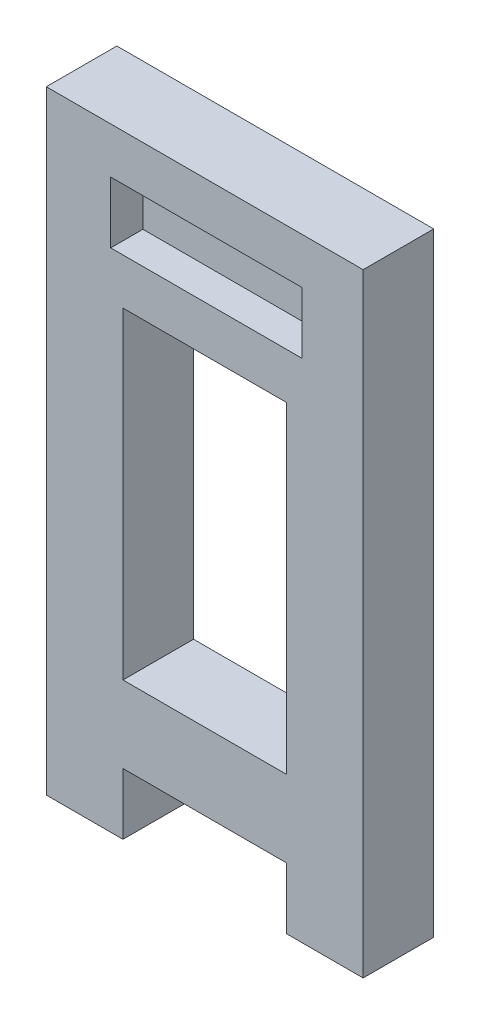
ISO-10303-21;
HEADER;
FILE_DESCRIPTION(('STEP AP214'),'2;1');
FILE_NAME('part.step','',(''),(''),'','','');
FILE_SCHEMA(('AUTOMOTIVE_DESIGN { 1 0 10303 214 1 1 1 1 }'));
ENDSEC;
DATA;
#1=APPLICATION_CONTEXT('core data for automotive mechanical design processes');
#2=APPLICATION_PROTOCOL_DEFINITION('international standard','automotive_design',2000,#1);
#3=PRODUCT_CONTEXT('',#1,'mechanical');
#4=PRODUCT('Part','Part','',(#3));
#5=PRODUCT_RELATED_PRODUCT_CATEGORY('part','',(#4));
#6=PRODUCT_DEFINITION_FORMATION('','',#4);
#7=PRODUCT_DEFINITION_CONTEXT('part definition',#1,'design');
#8=PRODUCT_DEFINITION('design','',#6,#7);
#9=PRODUCT_DEFINITION_SHAPE('','',#8);
#10=(LENGTH_UNIT() NAMED_UNIT(*) SI_UNIT(.MILLI.,.METRE.));
#11=(NAMED_UNIT(*) PLANE_ANGLE_UNIT() SI_UNIT($,.RADIAN.));
#12=(NAMED_UNIT(*) SI_UNIT($,.STERADIAN.) SOLID_ANGLE_UNIT());
#13=UNCERTAINTY_MEASURE_WITH_UNIT(LENGTH_MEASURE(1.E-05),#10,'distance_accuracy_value','');
#14=(GEOMETRIC_REPRESENTATION_CONTEXT(3) GLOBAL_UNCERTAINTY_ASSIGNED_CONTEXT((#13)) GLOBAL_UNIT_ASSIGNED_CONTEXT((#10,
#11,#12)) REPRESENTATION_CONTEXT('',''));
#15=CARTESIAN_POINT('',(0.,0.,0.));
#16=DIRECTION('',(0.,0.,1.));
#17=DIRECTION('',(1.,0.,0.));
#18=AXIS2_PLACEMENT_3D('',#15,#16,#17);
#19=CARTESIAN_POINT('',(2.1,14.5,2.3));
#20=DIRECTION('',(1.,0.,0.));
#21=DIRECTION('',(0.,0.,-1.));
#22=AXIS2_PLACEMENT_3D('',#19,#20,#21);
#23=PLANE('',#22);
#24=DIRECTION('',(0.,0.,-1.));
#25=VECTOR('',#24,1.);
#26=CARTESIAN_POINT('',(2.1,14.5,2.3));
#27=LINE('',#26,#25);
#28=CARTESIAN_POINT('',(2.1,14.5,2.3));
#29=VERTEX_POINT('',#28);
#30=CARTESIAN_POINT('',(2.1,14.5,1.25));
#31=VERTEX_POINT('',#30);
#32=EDGE_CURVE('E162',#29,#31,#27,.T.);
#33=ORIENTED_EDGE('',*,*,#32,.T.);
#34=DIRECTION('',(0.,1.,0.));
#35=VECTOR('',#34,1.);
#36=CARTESIAN_POINT('',(2.1,14.5,1.25));
#37=LINE('',#36,#35);
#38=CARTESIAN_POINT('',(2.1,16.5,1.25));
#39=VERTEX_POINT('',#38);
#40=EDGE_CURVE('E152',#31,#39,#37,.T.);
#41=ORIENTED_EDGE('',*,*,#40,.T.);
#42=DIRECTION('',(0.,0.,-1.));
#43=VECTOR('',#42,1.);
#44=CARTESIAN_POINT('',(2.1,16.5,2.3));
#45=LINE('',#44,#43);
#46=CARTESIAN_POINT('',(2.1,16.5,2.3));
#47=VERTEX_POINT('',#46);
#48=EDGE_CURVE('E159',#47,#39,#45,.T.);
#49=ORIENTED_EDGE('',*,*,#48,.F.);
#50=DIRECTION('',(0.,-1.,0.));
#51=VECTOR('',#50,1.);
#52=CARTESIAN_POINT('',(2.1,14.5,2.3));
#53=LINE('',#52,#51);
#54=EDGE_CURVE('E479',#47,#29,#53,.T.);
#55=ORIENTED_EDGE('',*,*,#54,.T.);
#56=EDGE_LOOP('',(#33,#41,#49,#55));
#57=FACE_BOUND('',#56,.T.);
#58=ADVANCED_FACE('F39',(#57),#23,.T.);
#59=CARTESIAN_POINT('',(2.1,14.5,2.3));
#60=DIRECTION('',(0.,1.,0.));
#61=DIRECTION('',(0.,0.,1.));
#62=AXIS2_PLACEMENT_3D('',#59,#60,#61);
#63=PLANE('',#62);
#64=DIRECTION('',(0.,0.,-1.));
#65=VECTOR('',#64,1.);
#66=CARTESIAN_POINT('',(8.33,14.5,2.3));
#67=LINE('',#66,#65);
#68=CARTESIAN_POINT('',(8.33,14.5,2.3));
#69=VERTEX_POINT('',#68);
#70=CARTESIAN_POINT('',(8.33,14.5,1.25));
#71=VERTEX_POINT('',#70);
#72=EDGE_CURVE('E168',#69,#71,#67,.T.);
#73=ORIENTED_EDGE('',*,*,#72,.T.);
#74=DIRECTION('',(1.,0.,0.));
#75=VECTOR('',#74,1.);
#76=CARTESIAN_POINT('',(2.1,14.5,1.25));
#77=LINE('',#76,#75);
#78=EDGE_CURVE('E480',#31,#71,#77,.T.);
#79=ORIENTED_EDGE('',*,*,#78,.F.);
#80=ORIENTED_EDGE('',*,*,#32,.F.);
#81=DIRECTION('',(1.,0.,0.));
#82=VECTOR('',#81,1.);
#83=CARTESIAN_POINT('',(2.1,14.5,2.3));
#84=LINE('',#83,#82);
#85=EDGE_CURVE('E478',#29,#69,#84,.T.);
#86=ORIENTED_EDGE('',*,*,#85,.T.);
#87=EDGE_LOOP('',(#73,#79,#80,#86));
#88=FACE_BOUND('',#87,.T.);
#89=ADVANCED_FACE('F312',(#88),#63,.T.);
#90=CARTESIAN_POINT('',(8.33,14.5,2.3));
#91=DIRECTION('',(-1.,0.,0.));
#92=DIRECTION('',(0.,0.,1.));
#93=AXIS2_PLACEMENT_3D('',#90,#91,#92);
#94=PLANE('',#93);
#95=DIRECTION('',(0.,0.,-1.));
#96=VECTOR('',#95,1.);
#97=CARTESIAN_POINT('',(8.33,16.5,2.3));
#98=LINE('',#97,#96);
#99=CARTESIAN_POINT('',(8.33,16.5,2.3));
#100=VERTEX_POINT('',#99);
#101=CARTESIAN_POINT('',(8.33,16.5,1.25));
#102=VERTEX_POINT('',#101);
#103=EDGE_CURVE('E61',#100,#102,#98,.T.);
#104=ORIENTED_EDGE('',*,*,#103,.T.);
#105=DIRECTION('',(0.,1.,0.));
#106=VECTOR('',#105,1.);
#107=CARTESIAN_POINT('',(8.33,14.5,1.25));
#108=LINE('',#107,#106);
#109=EDGE_CURVE('E54',#71,#102,#108,.T.);
#110=ORIENTED_EDGE('',*,*,#109,.F.);
#111=ORIENTED_EDGE('',*,*,#72,.F.);
#112=DIRECTION('',(0.,1.,0.));
#113=VECTOR('',#112,1.);
#114=CARTESIAN_POINT('',(8.33,14.5,2.3));
#115=LINE('',#114,#113);
#116=EDGE_CURVE('E170',#69,#100,#115,.T.);
#117=ORIENTED_EDGE('',*,*,#116,.T.);
#118=EDGE_LOOP('',(#104,#110,#111,#117));
#119=FACE_BOUND('',#118,.T.);
#120=ADVANCED_FACE('F318',(#119),#94,.T.);
#121=CARTESIAN_POINT('',(2.1,16.5,2.3));
#122=DIRECTION('',(0.,-1.,0.));
#123=DIRECTION('',(0.,0.,-1.));
#124=AXIS2_PLACEMENT_3D('',#121,#122,#123);
#125=PLANE('',#124);
#126=ORIENTED_EDGE('',*,*,#48,.T.);
#127=DIRECTION('',(1.,0.,0.));
#128=VECTOR('',#127,1.);
#129=CARTESIAN_POINT('',(2.1,16.5,1.25));
#130=LINE('',#129,#128);
#131=EDGE_CURVE('E149',#39,#102,#130,.T.);
#132=ORIENTED_EDGE('',*,*,#131,.T.);
#133=ORIENTED_EDGE('',*,*,#103,.F.);
#134=DIRECTION('',(-1.,0.,0.));
#135=VECTOR('',#134,1.);
#136=CARTESIAN_POINT('',(2.1,16.5,2.3));
#137=LINE('',#136,#135);
#138=EDGE_CURVE('E166',#100,#47,#137,.T.);
#139=ORIENTED_EDGE('',*,*,#138,.T.);
#140=EDGE_LOOP('',(#126,#132,#133,#139));
#141=FACE_BOUND('',#140,.T.);
#142=ADVANCED_FACE('F164',(#141),#125,.T.);
#143=CARTESIAN_POINT('',(0.,0.,2.3));
#144=DIRECTION('',(0.,0.,-1.));
#145=DIRECTION('',(-1.,0.,0.));
#146=AXIS2_PLACEMENT_3D('',#143,#144,#145);
#147=PLANE('',#146);
#148=DIRECTION('',(0.,1.,0.));
#149=VECTOR('',#148,1.);
#150=CARTESIAN_POINT('',(7.83,2.5,2.3));
#151=LINE('',#150,#149);
#152=CARTESIAN_POINT('',(7.83,2.5,2.3));
#153=VERTEX_POINT('',#152);
#154=CARTESIAN_POINT('',(7.83,13.,2.3));
#155=VERTEX_POINT('',#154);
#156=EDGE_CURVE('E178',#153,#155,#151,.T.);
#157=ORIENTED_EDGE('',*,*,#156,.F.);
#158=DIRECTION('',(1.,0.,0.));
#159=VECTOR('',#158,1.);
#160=CARTESIAN_POINT('',(2.5,2.5,2.3));
#161=LINE('',#160,#159);
#162=CARTESIAN_POINT('',(2.5,2.5,2.3));
#163=VERTEX_POINT('',#162);
#164=EDGE_CURVE('E186',#163,#153,#161,.T.);
#165=ORIENTED_EDGE('',*,*,#164,.F.);
#166=DIRECTION('',(0.,-1.,0.));
#167=VECTOR('',#166,1.);
#168=CARTESIAN_POINT('',(2.5,2.5,2.3));
#169=LINE('',#168,#167);
#170=CARTESIAN_POINT('',(2.5,13.,2.3));
#171=VERTEX_POINT('',#170);
#172=EDGE_CURVE('E183',#171,#163,#169,.T.);
#173=ORIENTED_EDGE('',*,*,#172,.F.);
#174=DIRECTION('',(-1.,0.,0.));
#175=VECTOR('',#174,1.);
#176=CARTESIAN_POINT('',(2.5,13.,2.3));
#177=LINE('',#176,#175);
#178=EDGE_CURVE('E180',#155,#171,#177,.T.);
#179=ORIENTED_EDGE('',*,*,#178,.F.);
#180=EDGE_LOOP('',(#157,#165,#173,#179));
#181=FACE_BOUND('',#180,.T.);
#182=DIRECTION('',(0.,-1.,0.));
#183=VECTOR('',#182,1.);
#184=CARTESIAN_POINT('',(0.,0.,2.3));
#185=LINE('',#184,#183);
#186=CARTESIAN_POINT('',(0.,18.,2.3));
#187=VERTEX_POINT('',#186);
#188=CARTESIAN_POINT('',(0.,-2.,2.3));
#189=VERTEX_POINT('',#188);
#190=EDGE_CURVE('E209',#187,#189,#185,.T.);
#191=ORIENTED_EDGE('',*,*,#190,.T.);
#192=DIRECTION('',(1.,0.,0.));
#193=VECTOR('',#192,1.);
#194=CARTESIAN_POINT('',(0.,-2.,2.3));
#195=LINE('',#194,#193);
#196=CARTESIAN_POINT('',(2.5,-2.,2.3));
#197=VERTEX_POINT('',#196);
#198=EDGE_CURVE('E211',#189,#197,#195,.T.);
#199=ORIENTED_EDGE('',*,*,#198,.T.);
#200=DIRECTION('',(0.,1.,0.));
#201=VECTOR('',#200,1.);
#202=CARTESIAN_POINT('',(2.5,-2.,2.3));
#203=LINE('',#202,#201);
#204=CARTESIAN_POINT('',(2.5,0.,2.3));
#205=VERTEX_POINT('',#204);
#206=EDGE_CURVE('E214',#197,#205,#203,.T.);
#207=ORIENTED_EDGE('',*,*,#206,.T.);
#208=DIRECTION('',(1.,0.,0.));
#209=VECTOR('',#208,1.);
#210=CARTESIAN_POINT('',(2.5,0.,2.3));
#211=LINE('',#210,#209);
#212=CARTESIAN_POINT('',(7.83,0.,2.3));
#213=VERTEX_POINT('',#212);
#214=EDGE_CURVE('E216',#205,#213,#211,.T.);
#215=ORIENTED_EDGE('',*,*,#214,.T.);
#216=DIRECTION('',(0.,-1.,0.));
#217=VECTOR('',#216,1.);
#218=CARTESIAN_POINT('',(7.83,-2.,2.3));
#219=LINE('',#218,#217);
#220=CARTESIAN_POINT('',(7.83,-2.,2.3));
#221=VERTEX_POINT('',#220);
#222=EDGE_CURVE('E218',#213,#221,#219,.T.);
#223=ORIENTED_EDGE('',*,*,#222,.T.);
#224=DIRECTION('',(1.,0.,0.));
#225=VECTOR('',#224,1.);
#226=CARTESIAN_POINT('',(10.33,-2.,2.3));
#227=LINE('',#226,#225);
#228=CARTESIAN_POINT('',(10.33,-2.,2.3));
#229=VERTEX_POINT('',#228);
#230=EDGE_CURVE('E220',#221,#229,#227,.T.);
#231=ORIENTED_EDGE('',*,*,#230,.T.);
#232=DIRECTION('',(0.,1.,0.));
#233=VECTOR('',#232,1.);
#234=CARTESIAN_POINT('',(10.33,0.,2.3));
#235=LINE('',#234,#233);
#236=CARTESIAN_POINT('',(10.33,18.,2.3));
#237=VERTEX_POINT('',#236);
#238=EDGE_CURVE('E222',#229,#237,#235,.T.);
#239=ORIENTED_EDGE('',*,*,#238,.T.);
#240=DIRECTION('',(-1.,0.,0.));
#241=VECTOR('',#240,1.);
#242=CARTESIAN_POINT('',(0.,18.,2.3));
#243=LINE('',#242,#241);
#244=EDGE_CURVE('E224',#237,#187,#243,.T.);
#245=ORIENTED_EDGE('',*,*,#244,.T.);
#246=EDGE_LOOP('',(#191,#199,#207,#215,#223,#231,#239,#245));
#247=FACE_BOUND('',#246,.T.);
#248=ORIENTED_EDGE('',*,*,#54,.F.);
#249=ORIENTED_EDGE('',*,*,#138,.F.);
#250=ORIENTED_EDGE('',*,*,#116,.F.);
#251=ORIENTED_EDGE('',*,*,#85,.F.);
#252=EDGE_LOOP('',(#248,#249,#250,#251));
#253=FACE_BOUND('',#252,.T.);
#254=ADVANCED_FACE('F285',(#181,#247,#253),#147,.F.);
#255=CARTESIAN_POINT('',(0.,0.,0.));
#256=DIRECTION('',(0.,0.,-1.));
#257=DIRECTION('',(-1.,0.,0.));
#258=AXIS2_PLACEMENT_3D('',#255,#256,#257);
#259=PLANE('',#258);
#260=DIRECTION('',(0.,-1.,0.));
#261=VECTOR('',#260,1.);
#262=CARTESIAN_POINT('',(0.,0.,0.));
#263=LINE('',#262,#261);
#264=CARTESIAN_POINT('',(0.,18.,0.));
#265=VERTEX_POINT('',#264);
#266=CARTESIAN_POINT('',(0.,-2.,0.));
#267=VERTEX_POINT('',#266);
#268=EDGE_CURVE('E208',#265,#267,#263,.T.);
#269=ORIENTED_EDGE('',*,*,#268,.F.);
#270=DIRECTION('',(-1.,0.,0.));
#271=VECTOR('',#270,1.);
#272=CARTESIAN_POINT('',(0.,18.,0.));
#273=LINE('',#272,#271);
#274=CARTESIAN_POINT('',(10.33,18.,0.));
#275=VERTEX_POINT('',#274);
#276=EDGE_CURVE('E212',#275,#265,#273,.T.);
#277=ORIENTED_EDGE('',*,*,#276,.F.);
#278=DIRECTION('',(0.,1.,0.));
#279=VECTOR('',#278,1.);
#280=CARTESIAN_POINT('',(10.33,0.,0.));
#281=LINE('',#280,#279);
#282=CARTESIAN_POINT('',(10.33,-2.,0.));
#283=VERTEX_POINT('',#282);
#284=EDGE_CURVE('E239',#283,#275,#281,.T.);
#285=ORIENTED_EDGE('',*,*,#284,.F.);
#286=DIRECTION('',(1.,0.,0.));
#287=VECTOR('',#286,1.);
#288=CARTESIAN_POINT('',(10.33,-2.,0.));
#289=LINE('',#288,#287);
#290=CARTESIAN_POINT('',(7.83,-2.,0.));
#291=VERTEX_POINT('',#290);
#292=EDGE_CURVE('E236',#291,#283,#289,.T.);
#293=ORIENTED_EDGE('',*,*,#292,.F.);
#294=DIRECTION('',(0.,-1.,0.));
#295=VECTOR('',#294,1.);
#296=CARTESIAN_POINT('',(7.83,-2.,0.));
#297=LINE('',#296,#295);
#298=CARTESIAN_POINT('',(7.83,0.,0.));
#299=VERTEX_POINT('',#298);
#300=EDGE_CURVE('E234',#299,#291,#297,.T.);
#301=ORIENTED_EDGE('',*,*,#300,.F.);
#302=DIRECTION('',(1.,0.,0.));
#303=VECTOR('',#302,1.);
#304=CARTESIAN_POINT('',(2.5,0.,0.));
#305=LINE('',#304,#303);
#306=CARTESIAN_POINT('',(2.5,0.,0.));
#307=VERTEX_POINT('',#306);
#308=EDGE_CURVE('E232',#307,#299,#305,.T.);
#309=ORIENTED_EDGE('',*,*,#308,.F.);
#310=DIRECTION('',(0.,1.,0.));
#311=VECTOR('',#310,1.);
#312=CARTESIAN_POINT('',(2.5,-2.,0.));
#313=LINE('',#312,#311);
#314=CARTESIAN_POINT('',(2.5,-2.,0.));
#315=VERTEX_POINT('',#314);
#316=EDGE_CURVE('E230',#315,#307,#313,.T.);
#317=ORIENTED_EDGE('',*,*,#316,.F.);
#318=DIRECTION('',(1.,0.,0.));
#319=VECTOR('',#318,1.);
#320=CARTESIAN_POINT('',(0.,-2.,0.));
#321=LINE('',#320,#319);
#322=EDGE_CURVE('E228',#267,#315,#321,.T.);
#323=ORIENTED_EDGE('',*,*,#322,.F.);
#324=EDGE_LOOP('',(#269,#277,#285,#293,#301,#309,#317,#323));
#325=FACE_BOUND('',#324,.T.);
#326=DIRECTION('',(1.,0.,0.));
#327=VECTOR('',#326,1.);
#328=CARTESIAN_POINT('',(2.5,2.5,0.));
#329=LINE('',#328,#327);
#330=CARTESIAN_POINT('',(2.5,2.5,0.));
#331=VERTEX_POINT('',#330);
#332=CARTESIAN_POINT('',(7.83,2.5,0.));
#333=VERTEX_POINT('',#332);
#334=EDGE_CURVE('E181',#331,#333,#329,.T.);
#335=ORIENTED_EDGE('',*,*,#334,.T.);
#336=DIRECTION('',(0.,1.,0.));
#337=VECTOR('',#336,1.);
#338=CARTESIAN_POINT('',(7.83,2.5,0.));
#339=LINE('',#338,#337);
#340=CARTESIAN_POINT('',(7.83,13.,0.));
#341=VERTEX_POINT('',#340);
#342=EDGE_CURVE('E177',#333,#341,#339,.T.);
#343=ORIENTED_EDGE('',*,*,#342,.T.);
#344=DIRECTION('',(-1.,0.,0.));
#345=VECTOR('',#344,1.);
#346=CARTESIAN_POINT('',(2.5,13.,0.));
#347=LINE('',#346,#345);
#348=CARTESIAN_POINT('',(2.5,13.,0.));
#349=VERTEX_POINT('',#348);
#350=EDGE_CURVE('E191',#341,#349,#347,.T.);
#351=ORIENTED_EDGE('',*,*,#350,.T.);
#352=DIRECTION('',(0.,-1.,0.));
#353=VECTOR('',#352,1.);
#354=CARTESIAN_POINT('',(2.5,2.5,0.));
#355=LINE('',#354,#353);
#356=EDGE_CURVE('E194',#349,#331,#355,.T.);
#357=ORIENTED_EDGE('',*,*,#356,.T.);
#358=EDGE_LOOP('',(#335,#343,#351,#357));
#359=FACE_BOUND('',#358,.T.);
#360=ADVANCED_FACE('F271',(#325,#359),#259,.T.);
#361=CARTESIAN_POINT('',(0.,0.,2.3));
#362=DIRECTION('',(1.,0.,0.));
#363=DIRECTION('',(0.,1.,0.));
#364=AXIS2_PLACEMENT_3D('',#361,#362,#363);
#365=PLANE('',#364);
#366=ORIENTED_EDGE('',*,*,#268,.T.);
#367=DIRECTION('',(0.,0.,-1.));
#368=VECTOR('',#367,1.);
#369=CARTESIAN_POINT('',(0.,-2.,2.3));
#370=LINE('',#369,#368);
#371=EDGE_CURVE('E11',#189,#267,#370,.T.);
#372=ORIENTED_EDGE('',*,*,#371,.F.);
#373=ORIENTED_EDGE('',*,*,#190,.F.);
#374=DIRECTION('',(0.,0.,-1.));
#375=VECTOR('',#374,1.);
#376=CARTESIAN_POINT('',(0.,18.,2.3));
#377=LINE('',#376,#375);
#378=EDGE_CURVE('E226',#187,#265,#377,.T.);
#379=ORIENTED_EDGE('',*,*,#378,.T.);
#380=EDGE_LOOP('',(#366,#372,#373,#379));
#381=FACE_BOUND('',#380,.T.);
#382=ADVANCED_FACE('F41',(#381),#365,.F.);
#383=CARTESIAN_POINT('',(0.,-2.,2.3));
#384=DIRECTION('',(0.,1.,0.));
#385=DIRECTION('',(0.,0.,1.));
#386=AXIS2_PLACEMENT_3D('',#383,#384,#385);
#387=PLANE('',#386);
#388=ORIENTED_EDGE('',*,*,#322,.T.);
#389=DIRECTION('',(0.,0.,-1.));
#390=VECTOR('',#389,1.);
#391=CARTESIAN_POINT('',(2.5,-2.,2.3));
#392=LINE('',#391,#390);
#393=EDGE_CURVE('E47',#197,#315,#392,.T.);
#394=ORIENTED_EDGE('',*,*,#393,.F.);
#395=ORIENTED_EDGE('',*,*,#198,.F.);
#396=ORIENTED_EDGE('',*,*,#371,.T.);
#397=EDGE_LOOP('',(#388,#394,#395,#396));
#398=FACE_BOUND('',#397,.T.);
#399=ADVANCED_FACE('F290',(#398),#387,.F.);
#400=CARTESIAN_POINT('',(2.5,-2.,2.3));
#401=DIRECTION('',(-1.,0.,0.));
#402=DIRECTION('',(0.,0.,1.));
#403=AXIS2_PLACEMENT_3D('',#400,#401,#402);
#404=PLANE('',#403);
#405=ORIENTED_EDGE('',*,*,#316,.T.);
#406=DIRECTION('',(0.,0.,-1.));
#407=VECTOR('',#406,1.);
#408=CARTESIAN_POINT('',(2.5,0.,2.3));
#409=LINE('',#408,#407);
#410=EDGE_CURVE('E257',#205,#307,#409,.T.);
#411=ORIENTED_EDGE('',*,*,#410,.F.);
#412=ORIENTED_EDGE('',*,*,#206,.F.);
#413=ORIENTED_EDGE('',*,*,#393,.T.);
#414=EDGE_LOOP('',(#405,#411,#412,#413));
#415=FACE_BOUND('',#414,.T.);
#416=ADVANCED_FACE('F264',(#415),#404,.F.);
#417=CARTESIAN_POINT('',(2.5,0.,2.3));
#418=DIRECTION('',(0.,1.,0.));
#419=DIRECTION('',(0.,0.,1.));
#420=AXIS2_PLACEMENT_3D('',#417,#418,#419);
#421=PLANE('',#420);
#422=ORIENTED_EDGE('',*,*,#308,.T.);
#423=DIRECTION('',(0.,0.,-1.));
#424=VECTOR('',#423,1.);
#425=CARTESIAN_POINT('',(7.83,0.,2.3));
#426=LINE('',#425,#424);
#427=EDGE_CURVE('E254',#213,#299,#426,.T.);
#428=ORIENTED_EDGE('',*,*,#427,.F.);
#429=ORIENTED_EDGE('',*,*,#214,.F.);
#430=ORIENTED_EDGE('',*,*,#410,.T.);
#431=EDGE_LOOP('',(#422,#428,#429,#430));
#432=FACE_BOUND('',#431,.T.);
#433=ADVANCED_FACE('F277',(#432),#421,.F.);
#434=CARTESIAN_POINT('',(7.83,-2.,2.3));
#435=DIRECTION('',(1.,0.,0.));
#436=DIRECTION('',(0.,0.,-1.));
#437=AXIS2_PLACEMENT_3D('',#434,#435,#436);
#438=PLANE('',#437);
#439=ORIENTED_EDGE('',*,*,#300,.T.);
#440=DIRECTION('',(0.,0.,-1.));
#441=VECTOR('',#440,1.);
#442=CARTESIAN_POINT('',(7.83,-2.,2.3));
#443=LINE('',#442,#441);
#444=EDGE_CURVE('E251',#221,#291,#443,.T.);
#445=ORIENTED_EDGE('',*,*,#444,.F.);
#446=ORIENTED_EDGE('',*,*,#222,.F.);
#447=ORIENTED_EDGE('',*,*,#427,.T.);
#448=EDGE_LOOP('',(#439,#445,#446,#447));
#449=FACE_BOUND('',#448,.T.);
#450=ADVANCED_FACE('F281',(#449),#438,.F.);
#451=CARTESIAN_POINT('',(10.33,-2.,2.3));
#452=DIRECTION('',(0.,1.,0.));
#453=DIRECTION('',(-1.,0.,0.));
#454=AXIS2_PLACEMENT_3D('',#451,#452,#453);
#455=PLANE('',#454);
#456=ORIENTED_EDGE('',*,*,#292,.T.);
#457=DIRECTION('',(0.,0.,-1.));
#458=VECTOR('',#457,1.);
#459=CARTESIAN_POINT('',(10.33,-2.,2.3));
#460=LINE('',#459,#458);
#461=EDGE_CURVE('E248',#229,#283,#460,.T.);
#462=ORIENTED_EDGE('',*,*,#461,.F.);
#463=ORIENTED_EDGE('',*,*,#230,.F.);
#464=ORIENTED_EDGE('',*,*,#444,.T.);
#465=EDGE_LOOP('',(#456,#462,#463,#464));
#466=FACE_BOUND('',#465,.T.);
#467=ADVANCED_FACE('F302',(#466),#455,.F.);
#468=CARTESIAN_POINT('',(10.33,0.,2.3));
#469=DIRECTION('',(-1.,0.,0.));
#470=DIRECTION('',(0.,0.,1.));
#471=AXIS2_PLACEMENT_3D('',#468,#469,#470);
#472=PLANE('',#471);
#473=ORIENTED_EDGE('',*,*,#284,.T.);
#474=DIRECTION('',(0.,0.,-1.));
#475=VECTOR('',#474,1.);
#476=CARTESIAN_POINT('',(10.33,18.,2.3));
#477=LINE('',#476,#475);
#478=EDGE_CURVE('E245',#237,#275,#477,.T.);
#479=ORIENTED_EDGE('',*,*,#478,.F.);
#480=ORIENTED_EDGE('',*,*,#238,.F.);
#481=ORIENTED_EDGE('',*,*,#461,.T.);
#482=EDGE_LOOP('',(#473,#479,#480,#481));
#483=FACE_BOUND('',#482,.T.);
#484=ADVANCED_FACE('F300',(#483),#472,.F.);
#485=CARTESIAN_POINT('',(0.,18.,2.3));
#486=DIRECTION('',(0.,-1.,0.));
#487=DIRECTION('',(0.,0.,-1.));
#488=AXIS2_PLACEMENT_3D('',#485,#486,#487);
#489=PLANE('',#488);
#490=ORIENTED_EDGE('',*,*,#276,.T.);
#491=ORIENTED_EDGE('',*,*,#378,.F.);
#492=ORIENTED_EDGE('',*,*,#244,.F.);
#493=ORIENTED_EDGE('',*,*,#478,.T.);
#494=EDGE_LOOP('',(#490,#491,#492,#493));
#495=FACE_BOUND('',#494,.T.);
#496=ADVANCED_FACE('F295',(#495),#489,.F.);
#497=CARTESIAN_POINT('',(7.83,2.5,2.3));
#498=DIRECTION('',(-1.,0.,0.));
#499=DIRECTION('',(0.,0.,1.));
#500=AXIS2_PLACEMENT_3D('',#497,#498,#499);
#501=PLANE('',#500);
#502=ORIENTED_EDGE('',*,*,#342,.F.);
#503=DIRECTION('',(0.,0.,-1.));
#504=VECTOR('',#503,1.);
#505=CARTESIAN_POINT('',(7.83,2.5,2.3));
#506=LINE('',#505,#504);
#507=EDGE_CURVE('E188',#153,#333,#506,.T.);
#508=ORIENTED_EDGE('',*,*,#507,.F.);
#509=ORIENTED_EDGE('',*,*,#156,.T.);
#510=DIRECTION('',(0.,0.,-1.));
#511=VECTOR('',#510,1.);
#512=CARTESIAN_POINT('',(7.83,13.,2.3));
#513=LINE('',#512,#511);
#514=EDGE_CURVE('E205',#155,#341,#513,.T.);
#515=ORIENTED_EDGE('',*,*,#514,.T.);
#516=EDGE_LOOP('',(#502,#508,#509,#515));
#517=FACE_BOUND('',#516,.T.);
#518=ADVANCED_FACE('F333',(#517),#501,.T.);
#519=CARTESIAN_POINT('',(2.5,13.,2.3));
#520=DIRECTION('',(0.,-1.,0.));
#521=DIRECTION('',(0.,0.,-1.));
#522=AXIS2_PLACEMENT_3D('',#519,#520,#521);
#523=PLANE('',#522);
#524=ORIENTED_EDGE('',*,*,#350,.F.);
#525=ORIENTED_EDGE('',*,*,#514,.F.);
#526=ORIENTED_EDGE('',*,*,#178,.T.);
#527=DIRECTION('',(0.,0.,-1.));
#528=VECTOR('',#527,1.);
#529=CARTESIAN_POINT('',(2.5,13.,2.3));
#530=LINE('',#529,#528);
#531=EDGE_CURVE('E203',#171,#349,#530,.T.);
#532=ORIENTED_EDGE('',*,*,#531,.T.);
#533=EDGE_LOOP('',(#524,#525,#526,#532));
#534=FACE_BOUND('',#533,.T.);
#535=ADVANCED_FACE('F329',(#534),#523,.T.);
#536=CARTESIAN_POINT('',(2.5,2.5,2.3));
#537=DIRECTION('',(1.,0.,0.));
#538=DIRECTION('',(0.,0.,-1.));
#539=AXIS2_PLACEMENT_3D('',#536,#537,#538);
#540=PLANE('',#539);
#541=ORIENTED_EDGE('',*,*,#356,.F.);
#542=ORIENTED_EDGE('',*,*,#531,.F.);
#543=ORIENTED_EDGE('',*,*,#172,.T.);
#544=DIRECTION('',(0.,0.,-1.));
#545=VECTOR('',#544,1.);
#546=CARTESIAN_POINT('',(2.5,2.5,2.3));
#547=LINE('',#546,#545);
#548=EDGE_CURVE('E201',#163,#331,#547,.T.);
#549=ORIENTED_EDGE('',*,*,#548,.T.);
#550=EDGE_LOOP('',(#541,#542,#543,#549));
#551=FACE_BOUND('',#550,.T.);
#552=ADVANCED_FACE('F325',(#551),#540,.T.);
#553=CARTESIAN_POINT('',(2.5,2.5,2.3));
#554=DIRECTION('',(0.,1.,0.));
#555=DIRECTION('',(0.,0.,1.));
#556=AXIS2_PLACEMENT_3D('',#553,#554,#555);
#557=PLANE('',#556);
#558=ORIENTED_EDGE('',*,*,#334,.F.);
#559=ORIENTED_EDGE('',*,*,#548,.F.);
#560=ORIENTED_EDGE('',*,*,#164,.T.);
#561=ORIENTED_EDGE('',*,*,#507,.T.);
#562=EDGE_LOOP('',(#558,#559,#560,#561));
#563=FACE_BOUND('',#562,.T.);
#564=ADVANCED_FACE('F323',(#563),#557,.T.);
#565=CARTESIAN_POINT('',(0.,0.,1.25));
#566=DIRECTION('',(0.,0.,-1.));
#567=DIRECTION('',(-1.,0.,0.));
#568=AXIS2_PLACEMENT_3D('',#565,#566,#567);
#569=PLANE('',#568);
#570=ORIENTED_EDGE('',*,*,#40,.F.);
#571=ORIENTED_EDGE('',*,*,#78,.T.);
#572=ORIENTED_EDGE('',*,*,#109,.T.);
#573=ORIENTED_EDGE('',*,*,#131,.F.);
#574=EDGE_LOOP('',(#570,#571,#572,#573));
#575=FACE_BOUND('',#574,.T.);
#576=ADVANCED_FACE('F151',(#575),#569,.F.);
#577=CLOSED_SHELL('',(#58,#89,#120,#142,#254,#360,#382,#399,#416,#433,#450,#467,#484,#496,#518,
#535,#552,#564,#576));
#578=MANIFOLD_SOLID_BREP('B2',#577);
#579=ADVANCED_BREP_SHAPE_REPRESENTATION('',(#18,#578),#14);
#580=SHAPE_DEFINITION_REPRESENTATION(#9,#579);
ENDSEC;
END-ISO-10303-21;
